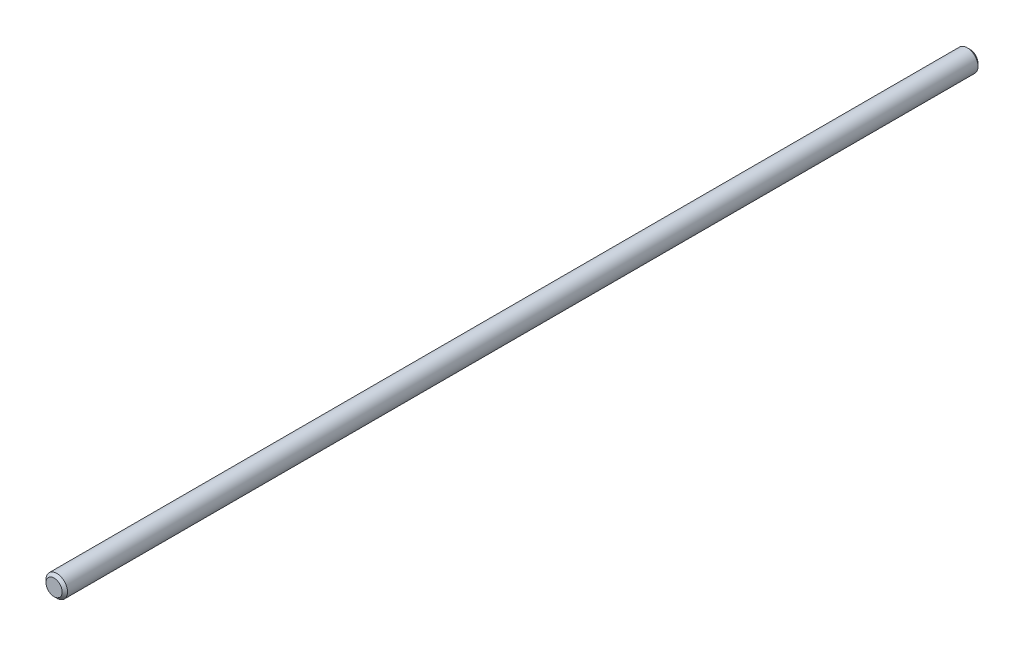
ISO-10303-21;
HEADER;
FILE_DESCRIPTION(('STEP AP214'),'2;1');
FILE_NAME('part.step','',(''),(''),'','','');
FILE_SCHEMA(('AUTOMOTIVE_DESIGN { 1 0 10303 214 1 1 1 1 }'));
ENDSEC;
DATA;
#1=APPLICATION_CONTEXT('core data for automotive mechanical design processes');
#2=APPLICATION_PROTOCOL_DEFINITION('international standard','automotive_design',2000,#1);
#3=PRODUCT_CONTEXT('',#1,'mechanical');
#4=PRODUCT('Part','Part','',(#3));
#5=PRODUCT_RELATED_PRODUCT_CATEGORY('part','',(#4));
#6=PRODUCT_DEFINITION_FORMATION('','',#4);
#7=PRODUCT_DEFINITION_CONTEXT('part definition',#1,'design');
#8=PRODUCT_DEFINITION('design','',#6,#7);
#9=PRODUCT_DEFINITION_SHAPE('','',#8);
#10=(LENGTH_UNIT() NAMED_UNIT(*) SI_UNIT(.MILLI.,.METRE.));
#11=(NAMED_UNIT(*) PLANE_ANGLE_UNIT() SI_UNIT($,.RADIAN.));
#12=(NAMED_UNIT(*) SI_UNIT($,.STERADIAN.) SOLID_ANGLE_UNIT());
#13=UNCERTAINTY_MEASURE_WITH_UNIT(LENGTH_MEASURE(1.E-05),#10,'distance_accuracy_value','');
#14=(GEOMETRIC_REPRESENTATION_CONTEXT(3) GLOBAL_UNCERTAINTY_ASSIGNED_CONTEXT((#13)) GLOBAL_UNIT_ASSIGNED_CONTEXT((#10,
#11,#12)) REPRESENTATION_CONTEXT('',''));
#15=CARTESIAN_POINT('',(0.,0.,0.));
#16=DIRECTION('',(0.,0.,1.));
#17=DIRECTION('',(1.,0.,0.));
#18=AXIS2_PLACEMENT_3D('',#15,#16,#17);
#19=CARTESIAN_POINT('',(0.,0.,-170.));
#20=DIRECTION('',(0.,0.,1.));
#21=DIRECTION('',(1.,0.,0.));
#22=AXIS2_PLACEMENT_3D('',#19,#20,#21);
#23=CYLINDRICAL_SURFACE('',#22,2.);
#24=CARTESIAN_POINT('',(0.,0.,-169.5));
#25=DIRECTION('',(0.,0.,1.));
#26=DIRECTION('',(1.,0.,0.));
#27=AXIS2_PLACEMENT_3D('',#24,#25,#26);
#28=CIRCLE('',#27,2.);
#29=CARTESIAN_POINT('',(2.,0.,-169.5));
#30=VERTEX_POINT('',#29);
#31=EDGE_CURVE('E43',#30,#30,#28,.T.);
#32=ORIENTED_EDGE('',*,*,#31,.T.);
#33=EDGE_LOOP('',(#32));
#34=FACE_BOUND('',#33,.T.);
#35=CARTESIAN_POINT('',(0.,0.,-0.5));
#36=DIRECTION('',(0.,0.,1.));
#37=DIRECTION('',(1.,0.,0.));
#38=AXIS2_PLACEMENT_3D('',#35,#36,#37);
#39=CIRCLE('',#38,2.);
#40=CARTESIAN_POINT('',(2.,0.,-0.5));
#41=VERTEX_POINT('',#40);
#42=EDGE_CURVE('E47',#41,#41,#39,.F.);
#43=ORIENTED_EDGE('',*,*,#42,.T.);
#44=EDGE_LOOP('',(#43));
#45=FACE_BOUND('',#44,.T.);
#46=ADVANCED_FACE('F32',(#34,#45),#23,.T.);
#47=CARTESIAN_POINT('',(0.,0.,-170.));
#48=DIRECTION('',(0.,0.,1.));
#49=DIRECTION('',(1.,0.,0.));
#50=AXIS2_PLACEMENT_3D('',#47,#48,#49);
#51=PLANE('',#50);
#52=CARTESIAN_POINT('',(0.,0.,-170.));
#53=DIRECTION('',(0.,0.,1.));
#54=DIRECTION('',(1.,0.,0.));
#55=AXIS2_PLACEMENT_3D('',#52,#53,#54);
#56=CIRCLE('',#55,1.49999999999993);
#57=CARTESIAN_POINT('',(1.49999999999993,0.,-170.));
#58=VERTEX_POINT('',#57);
#59=EDGE_CURVE('E39',#58,#58,#56,.F.);
#60=ORIENTED_EDGE('',*,*,#59,.T.);
#61=EDGE_LOOP('',(#60));
#62=FACE_BOUND('',#61,.T.);
#63=ADVANCED_FACE('F63',(#62),#51,.F.);
#64=CARTESIAN_POINT('',(0.,0.,0.));
#65=DIRECTION('',(0.,0.,1.));
#66=DIRECTION('',(1.,0.,0.));
#67=AXIS2_PLACEMENT_3D('',#64,#65,#66);
#68=PLANE('',#67);
#69=CARTESIAN_POINT('',(0.,0.,0.));
#70=DIRECTION('',(0.,0.,1.));
#71=DIRECTION('',(1.,0.,0.));
#72=AXIS2_PLACEMENT_3D('',#69,#70,#71);
#73=CIRCLE('',#72,1.50000000000002);
#74=CARTESIAN_POINT('',(1.50000000000002,0.,0.));
#75=VERTEX_POINT('',#74);
#76=EDGE_CURVE('E10',#75,#75,#73,.T.);
#77=ORIENTED_EDGE('',*,*,#76,.T.);
#78=EDGE_LOOP('',(#77));
#79=FACE_BOUND('',#78,.T.);
#80=ADVANCED_FACE('F60',(#79),#68,.T.);
#81=CARTESIAN_POINT('',(0.,0.,-169.5));
#82=DIRECTION('',(0.,0.,1.));
#83=DIRECTION('',(1.,0.,0.));
#84=AXIS2_PLACEMENT_3D('',#81,#82,#83);
#85=CONICAL_SURFACE('',#84,2.,0.785398163397433);
#86=ORIENTED_EDGE('',*,*,#59,.F.);
#87=EDGE_LOOP('',(#86));
#88=FACE_BOUND('',#87,.T.);
#89=ORIENTED_EDGE('',*,*,#31,.F.);
#90=EDGE_LOOP('',(#89));
#91=FACE_BOUND('',#90,.T.);
#92=ADVANCED_FACE('F56',(#88,#91),#85,.T.);
#93=CARTESIAN_POINT('',(0.,0.,0.));
#94=DIRECTION('',(0.,0.,-1.));
#95=DIRECTION('',(-1.,0.,0.));
#96=AXIS2_PLACEMENT_3D('',#93,#94,#95);
#97=CONICAL_SURFACE('',#96,1.50000000000002,0.785398163397433);
#98=ORIENTED_EDGE('',*,*,#42,.F.);
#99=EDGE_LOOP('',(#98));
#100=FACE_BOUND('',#99,.T.);
#101=ORIENTED_EDGE('',*,*,#76,.F.);
#102=EDGE_LOOP('',(#101));
#103=FACE_BOUND('',#102,.T.);
#104=ADVANCED_FACE('F34',(#100,#103),#97,.T.);
#105=CLOSED_SHELL('',(#46,#63,#80,#92,#104));
#106=MANIFOLD_SOLID_BREP('B2',#105);
#107=ADVANCED_BREP_SHAPE_REPRESENTATION('',(#18,#106),#14);
#108=SHAPE_DEFINITION_REPRESENTATION(#9,#107);
ENDSEC;
END-ISO-10303-21;
